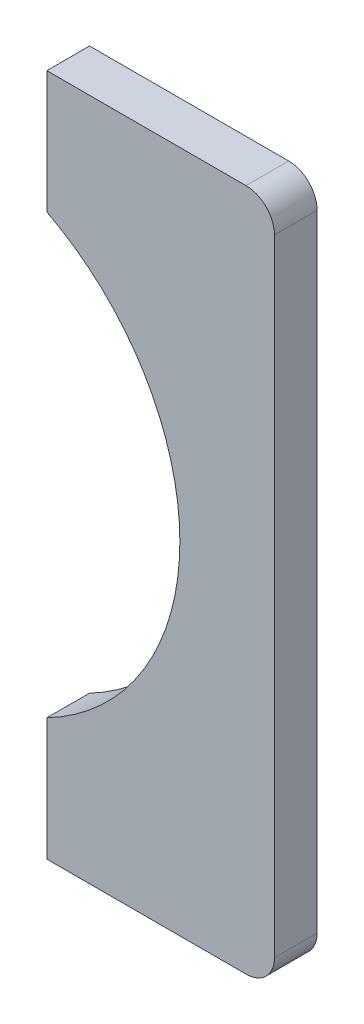
ISO-10303-21;
HEADER;
FILE_DESCRIPTION(('STEP AP214'),'2;1');
FILE_NAME('part.step','',(''),(''),'','','');
FILE_SCHEMA(('AUTOMOTIVE_DESIGN { 1 0 10303 214 1 1 1 1 }'));
ENDSEC;
DATA;
#1=APPLICATION_CONTEXT('core data for automotive mechanical design processes');
#2=APPLICATION_PROTOCOL_DEFINITION('international standard','automotive_design',2000,#1);
#3=PRODUCT_CONTEXT('',#1,'mechanical');
#4=PRODUCT('Part','Part','',(#3));
#5=PRODUCT_RELATED_PRODUCT_CATEGORY('part','',(#4));
#6=PRODUCT_DEFINITION_FORMATION('','',#4);
#7=PRODUCT_DEFINITION_CONTEXT('part definition',#1,'design');
#8=PRODUCT_DEFINITION('design','',#6,#7);
#9=PRODUCT_DEFINITION_SHAPE('','',#8);
#10=(LENGTH_UNIT() NAMED_UNIT(*) SI_UNIT(.MILLI.,.METRE.));
#11=(NAMED_UNIT(*) PLANE_ANGLE_UNIT() SI_UNIT($,.RADIAN.));
#12=(NAMED_UNIT(*) SI_UNIT($,.STERADIAN.) SOLID_ANGLE_UNIT());
#13=UNCERTAINTY_MEASURE_WITH_UNIT(LENGTH_MEASURE(1.E-05),#10,'distance_accuracy_value','');
#14=(GEOMETRIC_REPRESENTATION_CONTEXT(3) GLOBAL_UNCERTAINTY_ASSIGNED_CONTEXT((#13)) GLOBAL_UNIT_ASSIGNED_CONTEXT((#10,
#11,#12)) REPRESENTATION_CONTEXT('',''));
#15=CARTESIAN_POINT('',(0.,0.,0.));
#16=DIRECTION('',(0.,0.,1.));
#17=DIRECTION('',(1.,0.,0.));
#18=AXIS2_PLACEMENT_3D('',#15,#16,#17);
#19=CARTESIAN_POINT('',(0.,0.,0.));
#20=DIRECTION('',(0.,0.,1.));
#21=DIRECTION('',(1.,0.,0.));
#22=AXIS2_PLACEMENT_3D('',#19,#20,#21);
#23=PLANE('',#22);
#24=CARTESIAN_POINT('',(0.,0.,0.));
#25=DIRECTION('',(0.,0.,-1.));
#26=DIRECTION('',(-1.,0.,0.));
#27=AXIS2_PLACEMENT_3D('',#24,#25,#26);
#28=CIRCLE('',#27,1.735);
#29=CARTESIAN_POINT('',(0.7999999999999,1.53955350670256,0.));
#30=VERTEX_POINT('',#29);
#31=CARTESIAN_POINT('',(0.8,-1.53955350670276,0.));
#32=VERTEX_POINT('',#31);
#33=EDGE_CURVE('E140',#30,#32,#28,.T.);
#34=ORIENTED_EDGE('',*,*,#33,.T.);
#35=DIRECTION('',(0.,1.,0.));
#36=VECTOR('',#35,1.);
#37=CARTESIAN_POINT('',(0.8,-2.4,0.));
#38=LINE('',#37,#36);
#39=CARTESIAN_POINT('',(0.8,-2.4,0.));
#40=VERTEX_POINT('',#39);
#41=EDGE_CURVE('E96',#32,#40,#38,.F.);
#42=ORIENTED_EDGE('',*,*,#41,.T.);
#43=DIRECTION('',(-1.,0.,0.));
#44=VECTOR('',#43,1.);
#45=CARTESIAN_POINT('',(2.4,-2.4,0.));
#46=LINE('',#45,#44);
#47=CARTESIAN_POINT('',(2.2,-2.4,0.));
#48=VERTEX_POINT('',#47);
#49=EDGE_CURVE('E92',#40,#48,#46,.F.);
#50=ORIENTED_EDGE('',*,*,#49,.T.);
#51=CARTESIAN_POINT('',(2.2,-2.2,0.));
#52=DIRECTION('',(0.,0.,-1.));
#53=DIRECTION('',(-1.,0.,0.));
#54=AXIS2_PLACEMENT_3D('',#51,#52,#53);
#55=CIRCLE('',#54,0.2);
#56=CARTESIAN_POINT('',(2.4,-2.2,0.));
#57=VERTEX_POINT('',#56);
#58=EDGE_CURVE('E135',#57,#48,#55,.T.);
#59=ORIENTED_EDGE('',*,*,#58,.F.);
#60=DIRECTION('',(0.,1.,0.));
#61=VECTOR('',#60,1.);
#62=CARTESIAN_POINT('',(2.4,2.4,0.));
#63=LINE('',#62,#61);
#64=CARTESIAN_POINT('',(2.4,2.2,0.));
#65=VERTEX_POINT('',#64);
#66=EDGE_CURVE('E130',#57,#65,#63,.T.);
#67=ORIENTED_EDGE('',*,*,#66,.T.);
#68=CARTESIAN_POINT('',(2.2,2.2,0.));
#69=DIRECTION('',(0.,0.,-1.));
#70=DIRECTION('',(-1.,0.,0.));
#71=AXIS2_PLACEMENT_3D('',#68,#69,#70);
#72=CIRCLE('',#71,0.2);
#73=CARTESIAN_POINT('',(2.2,2.4,0.));
#74=VERTEX_POINT('',#73);
#75=EDGE_CURVE('E20',#74,#65,#72,.T.);
#76=ORIENTED_EDGE('',*,*,#75,.F.);
#77=DIRECTION('',(1.,0.,0.));
#78=VECTOR('',#77,1.);
#79=CARTESIAN_POINT('',(0.8,2.4,0.));
#80=LINE('',#79,#78);
#81=CARTESIAN_POINT('',(0.8,2.4,0.));
#82=VERTEX_POINT('',#81);
#83=EDGE_CURVE('E74',#74,#82,#80,.F.);
#84=ORIENTED_EDGE('',*,*,#83,.T.);
#85=DIRECTION('',(0.,1.,0.));
#86=VECTOR('',#85,1.);
#87=CARTESIAN_POINT('',(0.8,2.4,0.));
#88=LINE('',#87,#86);
#89=EDGE_CURVE('E144',#82,#30,#88,.F.);
#90=ORIENTED_EDGE('',*,*,#89,.T.);
#91=EDGE_LOOP('',(#34,#42,#50,#59,#67,#76,#84,#90));
#92=FACE_BOUND('',#91,.T.);
#93=ADVANCED_FACE('F17',(#92),#23,.T.);
#94=CARTESIAN_POINT('',(2.2,2.2,-0.3));
#95=DIRECTION('',(0.,0.,-1.));
#96=DIRECTION('',(-1.,0.,0.));
#97=AXIS2_PLACEMENT_3D('',#94,#95,#96);
#98=CYLINDRICAL_SURFACE('',#97,0.2);
#99=ORIENTED_EDGE('',*,*,#75,.T.);
#100=DIRECTION('',(0.,0.,1.));
#101=VECTOR('',#100,1.);
#102=CARTESIAN_POINT('',(2.4,2.2,-0.3));
#103=LINE('',#102,#101);
#104=CARTESIAN_POINT('',(2.4,2.2,-0.3));
#105=VERTEX_POINT('',#104);
#106=EDGE_CURVE('E131',#65,#105,#103,.F.);
#107=ORIENTED_EDGE('',*,*,#106,.T.);
#108=CARTESIAN_POINT('',(2.2,2.2,-0.3));
#109=DIRECTION('',(0.,0.,-1.));
#110=DIRECTION('',(-1.,0.,0.));
#111=AXIS2_PLACEMENT_3D('',#108,#109,#110);
#112=CIRCLE('',#111,0.2);
#113=CARTESIAN_POINT('',(2.2,2.4,-0.3));
#114=VERTEX_POINT('',#113);
#115=EDGE_CURVE('E126',#105,#114,#112,.F.);
#116=ORIENTED_EDGE('',*,*,#115,.T.);
#117=DIRECTION('',(0.,0.,1.));
#118=VECTOR('',#117,1.);
#119=CARTESIAN_POINT('',(2.2,2.4,-0.3));
#120=LINE('',#119,#118);
#121=EDGE_CURVE('E150',#114,#74,#120,.T.);
#122=ORIENTED_EDGE('',*,*,#121,.T.);
#123=EDGE_LOOP('',(#99,#107,#116,#122));
#124=FACE_BOUND('',#123,.T.);
#125=ADVANCED_FACE('F179',(#124),#98,.T.);
#126=CARTESIAN_POINT('',(0.8,2.4,-0.3));
#127=DIRECTION('',(0.,-1.,0.));
#128=DIRECTION('',(1.,0.,0.));
#129=AXIS2_PLACEMENT_3D('',#126,#127,#128);
#130=PLANE('',#129);
#131=ORIENTED_EDGE('',*,*,#121,.F.);
#132=DIRECTION('',(1.,0.,0.));
#133=VECTOR('',#132,1.);
#134=CARTESIAN_POINT('',(0.,2.4,-0.3));
#135=LINE('',#134,#133);
#136=CARTESIAN_POINT('',(0.8,2.4,-0.3));
#137=VERTEX_POINT('',#136);
#138=EDGE_CURVE('E121',#114,#137,#135,.F.);
#139=ORIENTED_EDGE('',*,*,#138,.T.);
#140=DIRECTION('',(0.,0.,-1.));
#141=VECTOR('',#140,1.);
#142=CARTESIAN_POINT('',(0.8,2.4,-0.3));
#143=LINE('',#142,#141);
#144=EDGE_CURVE('E145',#137,#82,#143,.F.);
#145=ORIENTED_EDGE('',*,*,#144,.T.);
#146=ORIENTED_EDGE('',*,*,#83,.F.);
#147=EDGE_LOOP('',(#131,#139,#145,#146));
#148=FACE_BOUND('',#147,.T.);
#149=ADVANCED_FACE('F177',(#148),#130,.F.);
#150=CARTESIAN_POINT('',(0.8,2.4,-0.3));
#151=DIRECTION('',(1.,0.,0.));
#152=DIRECTION('',(0.,0.,-1.));
#153=AXIS2_PLACEMENT_3D('',#150,#151,#152);
#154=PLANE('',#153);
#155=ORIENTED_EDGE('',*,*,#144,.F.);
#156=DIRECTION('',(0.,1.,0.));
#157=VECTOR('',#156,1.);
#158=CARTESIAN_POINT('',(0.8,0.,-0.3));
#159=LINE('',#158,#157);
#160=CARTESIAN_POINT('',(0.7999999999999,1.53955350670256,-0.3));
#161=VERTEX_POINT('',#160);
#162=EDGE_CURVE('E112',#137,#161,#159,.F.);
#163=ORIENTED_EDGE('',*,*,#162,.T.);
#164=DIRECTION('',(0.,0.,-1.));
#165=VECTOR('',#164,1.);
#166=CARTESIAN_POINT('',(0.7999999999998,1.53955350670262,-0.3));
#167=LINE('',#166,#165);
#168=EDGE_CURVE('E141',#161,#30,#167,.F.);
#169=ORIENTED_EDGE('',*,*,#168,.T.);
#170=ORIENTED_EDGE('',*,*,#89,.F.);
#171=EDGE_LOOP('',(#155,#163,#169,#170));
#172=FACE_BOUND('',#171,.T.);
#173=ADVANCED_FACE('F175',(#172),#154,.F.);
#174=CARTESIAN_POINT('',(0.,0.,-0.3));
#175=DIRECTION('',(0.,0.,-1.));
#176=DIRECTION('',(-1.,0.,0.));
#177=AXIS2_PLACEMENT_3D('',#174,#175,#176);
#178=CYLINDRICAL_SURFACE('',#177,1.735);
#179=ORIENTED_EDGE('',*,*,#168,.F.);
#180=CARTESIAN_POINT('',(0.,0.,-0.3));
#181=DIRECTION('',(0.,0.,-1.));
#182=DIRECTION('',(-1.,0.,0.));
#183=AXIS2_PLACEMENT_3D('',#180,#181,#182);
#184=CIRCLE('',#183,1.735);
#185=CARTESIAN_POINT('',(0.8,-1.53955350670276,-0.3));
#186=VERTEX_POINT('',#185);
#187=EDGE_CURVE('E110',#161,#186,#184,.T.);
#188=ORIENTED_EDGE('',*,*,#187,.T.);
#189=DIRECTION('',(0.,0.,-1.));
#190=VECTOR('',#189,1.);
#191=CARTESIAN_POINT('',(0.8,-1.539553506703,-0.3));
#192=LINE('',#191,#190);
#193=EDGE_CURVE('E109',#186,#32,#192,.F.);
#194=ORIENTED_EDGE('',*,*,#193,.T.);
#195=ORIENTED_EDGE('',*,*,#33,.F.);
#196=EDGE_LOOP('',(#179,#188,#194,#195));
#197=FACE_BOUND('',#196,.T.);
#198=ADVANCED_FACE('F171',(#197),#178,.F.);
#199=CARTESIAN_POINT('',(0.8,-2.4,-0.3));
#200=DIRECTION('',(1.,0.,0.));
#201=DIRECTION('',(0.,0.,-1.));
#202=AXIS2_PLACEMENT_3D('',#199,#200,#201);
#203=PLANE('',#202);
#204=ORIENTED_EDGE('',*,*,#193,.F.);
#205=DIRECTION('',(0.,1.,0.));
#206=VECTOR('',#205,1.);
#207=CARTESIAN_POINT('',(0.8,0.,-0.3));
#208=LINE('',#207,#206);
#209=CARTESIAN_POINT('',(0.8,-2.4,-0.3));
#210=VERTEX_POINT('',#209);
#211=EDGE_CURVE('E103',#186,#210,#208,.F.);
#212=ORIENTED_EDGE('',*,*,#211,.T.);
#213=DIRECTION('',(0.,0.,1.));
#214=VECTOR('',#213,1.);
#215=CARTESIAN_POINT('',(0.8,-2.4,-0.3));
#216=LINE('',#215,#214);
#217=EDGE_CURVE('E86',#210,#40,#216,.T.);
#218=ORIENTED_EDGE('',*,*,#217,.T.);
#219=ORIENTED_EDGE('',*,*,#41,.F.);
#220=EDGE_LOOP('',(#204,#212,#218,#219));
#221=FACE_BOUND('',#220,.T.);
#222=ADVANCED_FACE('F107',(#221),#203,.F.);
#223=CARTESIAN_POINT('',(2.4,-2.4,-0.3));
#224=DIRECTION('',(0.,1.,0.));
#225=DIRECTION('',(-1.,0.,0.));
#226=AXIS2_PLACEMENT_3D('',#223,#224,#225);
#227=PLANE('',#226);
#228=DIRECTION('',(0.,0.,-1.));
#229=VECTOR('',#228,1.);
#230=CARTESIAN_POINT('',(2.2,-2.4,-0.3));
#231=LINE('',#230,#229);
#232=CARTESIAN_POINT('',(2.2,-2.4,-0.3));
#233=VERTEX_POINT('',#232);
#234=EDGE_CURVE('E134',#48,#233,#231,.T.);
#235=ORIENTED_EDGE('',*,*,#234,.F.);
#236=ORIENTED_EDGE('',*,*,#49,.F.);
#237=ORIENTED_EDGE('',*,*,#217,.F.);
#238=DIRECTION('',(1.,0.,0.));
#239=VECTOR('',#238,1.);
#240=CARTESIAN_POINT('',(0.,-2.4,-0.3));
#241=LINE('',#240,#239);
#242=EDGE_CURVE('E90',#210,#233,#241,.T.);
#243=ORIENTED_EDGE('',*,*,#242,.T.);
#244=EDGE_LOOP('',(#235,#236,#237,#243));
#245=FACE_BOUND('',#244,.T.);
#246=ADVANCED_FACE('F89',(#245),#227,.F.);
#247=CARTESIAN_POINT('',(2.2,-2.2,-0.3));
#248=DIRECTION('',(0.,0.,-1.));
#249=DIRECTION('',(-1.,0.,0.));
#250=AXIS2_PLACEMENT_3D('',#247,#248,#249);
#251=CYLINDRICAL_SURFACE('',#250,0.2);
#252=ORIENTED_EDGE('',*,*,#58,.T.);
#253=ORIENTED_EDGE('',*,*,#234,.T.);
#254=CARTESIAN_POINT('',(2.2,-2.2,-0.3));
#255=DIRECTION('',(0.,0.,-1.));
#256=DIRECTION('',(-1.,0.,0.));
#257=AXIS2_PLACEMENT_3D('',#254,#255,#256);
#258=CIRCLE('',#257,0.2);
#259=CARTESIAN_POINT('',(2.4,-2.2,-0.3));
#260=VERTEX_POINT('',#259);
#261=EDGE_CURVE('E26',#233,#260,#258,.F.);
#262=ORIENTED_EDGE('',*,*,#261,.T.);
#263=DIRECTION('',(0.,0.,1.));
#264=VECTOR('',#263,1.);
#265=CARTESIAN_POINT('',(2.4,-2.2,-0.3));
#266=LINE('',#265,#264);
#267=EDGE_CURVE('E34',#260,#57,#266,.T.);
#268=ORIENTED_EDGE('',*,*,#267,.T.);
#269=EDGE_LOOP('',(#252,#253,#262,#268));
#270=FACE_BOUND('',#269,.T.);
#271=ADVANCED_FACE('F183',(#270),#251,.T.);
#272=CARTESIAN_POINT('',(2.4,2.4,-0.3));
#273=DIRECTION('',(-1.,0.,0.));
#274=DIRECTION('',(0.,0.,1.));
#275=AXIS2_PLACEMENT_3D('',#272,#273,#274);
#276=PLANE('',#275);
#277=ORIENTED_EDGE('',*,*,#267,.F.);
#278=DIRECTION('',(0.,1.,0.));
#279=VECTOR('',#278,1.);
#280=CARTESIAN_POINT('',(2.4,0.,-0.3));
#281=LINE('',#280,#279);
#282=EDGE_CURVE('E11',#260,#105,#281,.T.);
#283=ORIENTED_EDGE('',*,*,#282,.T.);
#284=ORIENTED_EDGE('',*,*,#106,.F.);
#285=ORIENTED_EDGE('',*,*,#66,.F.);
#286=EDGE_LOOP('',(#277,#283,#284,#285));
#287=FACE_BOUND('',#286,.T.);
#288=ADVANCED_FACE('F181',(#287),#276,.F.);
#289=CARTESIAN_POINT('',(0.,0.,-0.3));
#290=DIRECTION('',(0.,0.,1.));
#291=DIRECTION('',(1.,0.,0.));
#292=AXIS2_PLACEMENT_3D('',#289,#290,#291);
#293=PLANE('',#292);
#294=ORIENTED_EDGE('',*,*,#261,.F.);
#295=ORIENTED_EDGE('',*,*,#242,.F.);
#296=ORIENTED_EDGE('',*,*,#211,.F.);
#297=ORIENTED_EDGE('',*,*,#187,.F.);
#298=ORIENTED_EDGE('',*,*,#162,.F.);
#299=ORIENTED_EDGE('',*,*,#138,.F.);
#300=ORIENTED_EDGE('',*,*,#115,.F.);
#301=ORIENTED_EDGE('',*,*,#282,.F.);
#302=EDGE_LOOP('',(#294,#295,#296,#297,#298,#299,#300,#301));
#303=FACE_BOUND('',#302,.T.);
#304=ADVANCED_FACE('F101',(#303),#293,.F.);
#305=CLOSED_SHELL('',(#93,#125,#149,#173,#198,#222,#246,#271,#288,#304));
#306=MANIFOLD_SOLID_BREP('B1',#305);
#307=ADVANCED_BREP_SHAPE_REPRESENTATION('',(#18,#306),#14);
#308=SHAPE_DEFINITION_REPRESENTATION(#9,#307);
ENDSEC;
END-ISO-10303-21;
